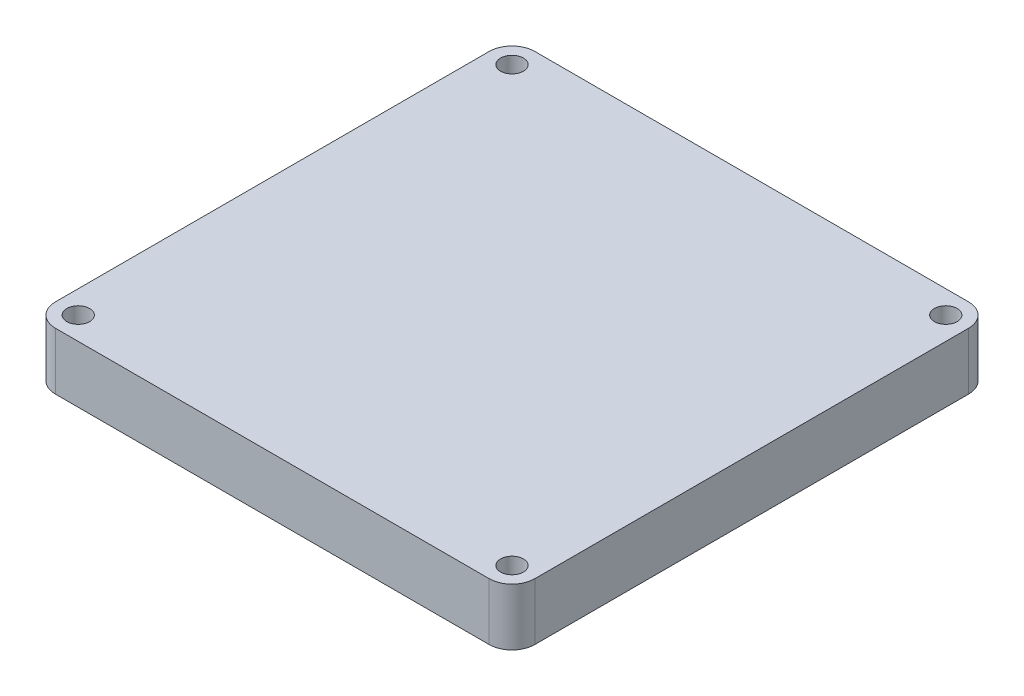
ISO-10303-21;
HEADER;
FILE_DESCRIPTION(('STEP AP214'),'2;1');
FILE_NAME('part.step','',(''),(''),'','','');
FILE_SCHEMA(('AUTOMOTIVE_DESIGN { 1 0 10303 214 1 1 1 1 }'));
ENDSEC;
DATA;
#1=APPLICATION_CONTEXT('core data for automotive mechanical design processes');
#2=APPLICATION_PROTOCOL_DEFINITION('international standard','automotive_design',2000,#1);
#3=PRODUCT_CONTEXT('',#1,'mechanical');
#4=PRODUCT('Part','Part','',(#3));
#5=PRODUCT_RELATED_PRODUCT_CATEGORY('part','',(#4));
#6=PRODUCT_DEFINITION_FORMATION('','',#4);
#7=PRODUCT_DEFINITION_CONTEXT('part definition',#1,'design');
#8=PRODUCT_DEFINITION('design','',#6,#7);
#9=PRODUCT_DEFINITION_SHAPE('','',#8);
#10=(LENGTH_UNIT() NAMED_UNIT(*) SI_UNIT(.MILLI.,.METRE.));
#11=(NAMED_UNIT(*) PLANE_ANGLE_UNIT() SI_UNIT($,.RADIAN.));
#12=(NAMED_UNIT(*) SI_UNIT($,.STERADIAN.) SOLID_ANGLE_UNIT());
#13=UNCERTAINTY_MEASURE_WITH_UNIT(LENGTH_MEASURE(1.E-05),#10,'distance_accuracy_value','');
#14=(GEOMETRIC_REPRESENTATION_CONTEXT(3) GLOBAL_UNCERTAINTY_ASSIGNED_CONTEXT((#13)) GLOBAL_UNIT_ASSIGNED_CONTEXT((#10,
#11,#12)) REPRESENTATION_CONTEXT('',''));
#15=CARTESIAN_POINT('',(0.,0.,0.));
#16=DIRECTION('',(0.,0.,1.));
#17=DIRECTION('',(1.,0.,0.));
#18=AXIS2_PLACEMENT_3D('',#15,#16,#17);
#19=CARTESIAN_POINT('',(19.,5.,-19.));
#20=DIRECTION('',(0.,-1.,0.));
#21=DIRECTION('',(0.,0.,-1.));
#22=AXIS2_PLACEMENT_3D('',#19,#20,#21);
#23=CYLINDRICAL_SURFACE('',#22,2.);
#24=CARTESIAN_POINT('',(19.,0.,-19.));
#25=DIRECTION('',(0.,1.,0.));
#26=DIRECTION('',(0.,0.,-1.));
#27=AXIS2_PLACEMENT_3D('',#24,#25,#26);
#28=CIRCLE('',#27,2.);
#29=CARTESIAN_POINT('',(21.,0.,-19.));
#30=VERTEX_POINT('',#29);
#31=CARTESIAN_POINT('',(19.,0.,-21.));
#32=VERTEX_POINT('',#31);
#33=EDGE_CURVE('E129',#30,#32,#28,.T.);
#34=ORIENTED_EDGE('',*,*,#33,.T.);
#35=DIRECTION('',(0.,-1.,0.));
#36=VECTOR('',#35,1.);
#37=CARTESIAN_POINT('',(19.,5.,-21.));
#38=LINE('',#37,#36);
#39=CARTESIAN_POINT('',(19.,5.,-21.));
#40=VERTEX_POINT('',#39);
#41=EDGE_CURVE('E11',#40,#32,#38,.T.);
#42=ORIENTED_EDGE('',*,*,#41,.F.);
#43=CARTESIAN_POINT('',(19.,5.,-19.));
#44=DIRECTION('',(0.,1.,0.));
#45=DIRECTION('',(0.,0.,-1.));
#46=AXIS2_PLACEMENT_3D('',#43,#44,#45);
#47=CIRCLE('',#46,2.);
#48=CARTESIAN_POINT('',(21.,5.,-19.));
#49=VERTEX_POINT('',#48);
#50=EDGE_CURVE('E144',#49,#40,#47,.T.);
#51=ORIENTED_EDGE('',*,*,#50,.F.);
#52=DIRECTION('',(0.,-1.,0.));
#53=VECTOR('',#52,1.);
#54=CARTESIAN_POINT('',(21.,5.,-19.));
#55=LINE('',#54,#53);
#56=EDGE_CURVE('E125',#49,#30,#55,.T.);
#57=ORIENTED_EDGE('',*,*,#56,.T.);
#58=EDGE_LOOP('',(#34,#42,#51,#57));
#59=FACE_BOUND('',#58,.T.);
#60=ADVANCED_FACE('F33',(#59),#23,.T.);
#61=CARTESIAN_POINT('',(-19.,5.,-21.));
#62=DIRECTION('',(0.,0.,1.));
#63=DIRECTION('',(1.,0.,0.));
#64=AXIS2_PLACEMENT_3D('',#61,#62,#63);
#65=PLANE('',#64);
#66=DIRECTION('',(-1.,0.,0.));
#67=VECTOR('',#66,1.);
#68=CARTESIAN_POINT('',(-19.,0.,-21.));
#69=LINE('',#68,#67);
#70=CARTESIAN_POINT('',(-19.,0.,-21.));
#71=VERTEX_POINT('',#70);
#72=EDGE_CURVE('E132',#32,#71,#69,.T.);
#73=ORIENTED_EDGE('',*,*,#72,.T.);
#74=DIRECTION('',(0.,-1.,0.));
#75=VECTOR('',#74,1.);
#76=CARTESIAN_POINT('',(-19.,5.,-21.));
#77=LINE('',#76,#75);
#78=CARTESIAN_POINT('',(-19.,5.,-21.));
#79=VERTEX_POINT('',#78);
#80=EDGE_CURVE('E41',#79,#71,#77,.T.);
#81=ORIENTED_EDGE('',*,*,#80,.F.);
#82=DIRECTION('',(-1.,0.,0.));
#83=VECTOR('',#82,1.);
#84=CARTESIAN_POINT('',(-19.,5.,-21.));
#85=LINE('',#84,#83);
#86=EDGE_CURVE('E92',#40,#79,#85,.T.);
#87=ORIENTED_EDGE('',*,*,#86,.F.);
#88=ORIENTED_EDGE('',*,*,#41,.T.);
#89=EDGE_LOOP('',(#73,#81,#87,#88));
#90=FACE_BOUND('',#89,.T.);
#91=ADVANCED_FACE('F229',(#90),#65,.F.);
#92=CARTESIAN_POINT('',(-19.,5.,-19.));
#93=DIRECTION('',(0.,-1.,0.));
#94=DIRECTION('',(0.,0.,-1.));
#95=AXIS2_PLACEMENT_3D('',#92,#93,#94);
#96=CYLINDRICAL_SURFACE('',#95,2.);
#97=CARTESIAN_POINT('',(-19.,0.,-19.));
#98=DIRECTION('',(0.,1.,0.));
#99=DIRECTION('',(0.,0.,-1.));
#100=AXIS2_PLACEMENT_3D('',#97,#98,#99);
#101=CIRCLE('',#100,2.);
#102=CARTESIAN_POINT('',(-21.,0.,-19.));
#103=VERTEX_POINT('',#102);
#104=EDGE_CURVE('E135',#71,#103,#101,.T.);
#105=ORIENTED_EDGE('',*,*,#104,.T.);
#106=DIRECTION('',(0.,-1.,0.));
#107=VECTOR('',#106,1.);
#108=CARTESIAN_POINT('',(-21.,5.,-19.));
#109=LINE('',#108,#107);
#110=CARTESIAN_POINT('',(-21.,5.,-19.));
#111=VERTEX_POINT('',#110);
#112=EDGE_CURVE('E151',#111,#103,#109,.T.);
#113=ORIENTED_EDGE('',*,*,#112,.F.);
#114=CARTESIAN_POINT('',(-19.,5.,-19.));
#115=DIRECTION('',(0.,1.,0.));
#116=DIRECTION('',(0.,0.,-1.));
#117=AXIS2_PLACEMENT_3D('',#114,#115,#116);
#118=CIRCLE('',#117,2.);
#119=EDGE_CURVE('E159',#79,#111,#118,.T.);
#120=ORIENTED_EDGE('',*,*,#119,.F.);
#121=ORIENTED_EDGE('',*,*,#80,.T.);
#122=EDGE_LOOP('',(#105,#113,#120,#121));
#123=FACE_BOUND('',#122,.T.);
#124=ADVANCED_FACE('F157',(#123),#96,.T.);
#125=CARTESIAN_POINT('',(-21.,5.,19.));
#126=DIRECTION('',(1.,0.,0.));
#127=DIRECTION('',(0.,0.,-1.));
#128=AXIS2_PLACEMENT_3D('',#125,#126,#127);
#129=PLANE('',#128);
#130=DIRECTION('',(0.,0.,1.));
#131=VECTOR('',#130,1.);
#132=CARTESIAN_POINT('',(-21.,0.,19.));
#133=LINE('',#132,#131);
#134=CARTESIAN_POINT('',(-21.,0.,19.));
#135=VERTEX_POINT('',#134);
#136=EDGE_CURVE('E137',#103,#135,#133,.T.);
#137=ORIENTED_EDGE('',*,*,#136,.T.);
#138=DIRECTION('',(0.,-1.,0.));
#139=VECTOR('',#138,1.);
#140=CARTESIAN_POINT('',(-21.,5.,19.));
#141=LINE('',#140,#139);
#142=CARTESIAN_POINT('',(-21.,5.,19.));
#143=VERTEX_POINT('',#142);
#144=EDGE_CURVE('E148',#143,#135,#141,.T.);
#145=ORIENTED_EDGE('',*,*,#144,.F.);
#146=DIRECTION('',(0.,0.,1.));
#147=VECTOR('',#146,1.);
#148=CARTESIAN_POINT('',(-21.,5.,19.));
#149=LINE('',#148,#147);
#150=EDGE_CURVE('E171',#111,#143,#149,.T.);
#151=ORIENTED_EDGE('',*,*,#150,.F.);
#152=ORIENTED_EDGE('',*,*,#112,.T.);
#153=EDGE_LOOP('',(#137,#145,#151,#152));
#154=FACE_BOUND('',#153,.T.);
#155=ADVANCED_FACE('F167',(#154),#129,.F.);
#156=CARTESIAN_POINT('',(-19.,5.,19.));
#157=DIRECTION('',(0.,-1.,0.));
#158=DIRECTION('',(0.,0.,-1.));
#159=AXIS2_PLACEMENT_3D('',#156,#157,#158);
#160=CYLINDRICAL_SURFACE('',#159,2.);
#161=CARTESIAN_POINT('',(-19.,0.,19.));
#162=DIRECTION('',(0.,1.,0.));
#163=DIRECTION('',(0.,0.,-1.));
#164=AXIS2_PLACEMENT_3D('',#161,#162,#163);
#165=CIRCLE('',#164,2.);
#166=CARTESIAN_POINT('',(-19.,0.,21.));
#167=VERTEX_POINT('',#166);
#168=EDGE_CURVE('E139',#135,#167,#165,.T.);
#169=ORIENTED_EDGE('',*,*,#168,.T.);
#170=DIRECTION('',(0.,-1.,0.));
#171=VECTOR('',#170,1.);
#172=CARTESIAN_POINT('',(-19.,5.,21.));
#173=LINE('',#172,#171);
#174=CARTESIAN_POINT('',(-19.,5.,21.));
#175=VERTEX_POINT('',#174);
#176=EDGE_CURVE('E120',#175,#167,#173,.T.);
#177=ORIENTED_EDGE('',*,*,#176,.F.);
#178=CARTESIAN_POINT('',(-19.,5.,19.));
#179=DIRECTION('',(0.,1.,0.));
#180=DIRECTION('',(0.,0.,-1.));
#181=AXIS2_PLACEMENT_3D('',#178,#179,#180);
#182=CIRCLE('',#181,2.);
#183=EDGE_CURVE('E111',#143,#175,#182,.T.);
#184=ORIENTED_EDGE('',*,*,#183,.F.);
#185=ORIENTED_EDGE('',*,*,#144,.T.);
#186=EDGE_LOOP('',(#169,#177,#184,#185));
#187=FACE_BOUND('',#186,.T.);
#188=ADVANCED_FACE('F170',(#187),#160,.T.);
#189=CARTESIAN_POINT('',(-19.,5.,21.));
#190=DIRECTION('',(0.,0.,-1.));
#191=DIRECTION('',(-1.,0.,0.));
#192=AXIS2_PLACEMENT_3D('',#189,#190,#191);
#193=PLANE('',#192);
#194=DIRECTION('',(1.,0.,0.));
#195=VECTOR('',#194,1.);
#196=CARTESIAN_POINT('',(-19.,0.,21.));
#197=LINE('',#196,#195);
#198=CARTESIAN_POINT('',(19.,0.,21.));
#199=VERTEX_POINT('',#198);
#200=EDGE_CURVE('E119',#167,#199,#197,.T.);
#201=ORIENTED_EDGE('',*,*,#200,.T.);
#202=DIRECTION('',(0.,-1.,0.));
#203=VECTOR('',#202,1.);
#204=CARTESIAN_POINT('',(19.,5.,21.));
#205=LINE('',#204,#203);
#206=CARTESIAN_POINT('',(19.,5.,21.));
#207=VERTEX_POINT('',#206);
#208=EDGE_CURVE('E116',#207,#199,#205,.T.);
#209=ORIENTED_EDGE('',*,*,#208,.F.);
#210=DIRECTION('',(1.,0.,0.));
#211=VECTOR('',#210,1.);
#212=CARTESIAN_POINT('',(-19.,5.,21.));
#213=LINE('',#212,#211);
#214=EDGE_CURVE('E105',#175,#207,#213,.T.);
#215=ORIENTED_EDGE('',*,*,#214,.F.);
#216=ORIENTED_EDGE('',*,*,#176,.T.);
#217=EDGE_LOOP('',(#201,#209,#215,#216));
#218=FACE_BOUND('',#217,.T.);
#219=ADVANCED_FACE('F117',(#218),#193,.F.);
#220=CARTESIAN_POINT('',(19.,5.,19.));
#221=DIRECTION('',(0.,-1.,0.));
#222=DIRECTION('',(0.,0.,-1.));
#223=AXIS2_PLACEMENT_3D('',#220,#221,#222);
#224=CYLINDRICAL_SURFACE('',#223,2.);
#225=CARTESIAN_POINT('',(19.,0.,19.));
#226=DIRECTION('',(0.,1.,0.));
#227=DIRECTION('',(0.,0.,1.));
#228=AXIS2_PLACEMENT_3D('',#225,#226,#227);
#229=CIRCLE('',#228,2.);
#230=CARTESIAN_POINT('',(21.,0.,19.));
#231=VERTEX_POINT('',#230);
#232=EDGE_CURVE('E78',#199,#231,#229,.T.);
#233=ORIENTED_EDGE('',*,*,#232,.T.);
#234=DIRECTION('',(0.,-1.,0.));
#235=VECTOR('',#234,1.);
#236=CARTESIAN_POINT('',(21.,5.,19.));
#237=LINE('',#236,#235);
#238=CARTESIAN_POINT('',(21.,5.,19.));
#239=VERTEX_POINT('',#238);
#240=EDGE_CURVE('E121',#239,#231,#237,.T.);
#241=ORIENTED_EDGE('',*,*,#240,.F.);
#242=CARTESIAN_POINT('',(19.,5.,19.));
#243=DIRECTION('',(0.,1.,0.));
#244=DIRECTION('',(0.,0.,1.));
#245=AXIS2_PLACEMENT_3D('',#242,#243,#244);
#246=CIRCLE('',#245,2.);
#247=EDGE_CURVE('E109',#207,#239,#246,.T.);
#248=ORIENTED_EDGE('',*,*,#247,.F.);
#249=ORIENTED_EDGE('',*,*,#208,.T.);
#250=EDGE_LOOP('',(#233,#241,#248,#249));
#251=FACE_BOUND('',#250,.T.);
#252=ADVANCED_FACE('F123',(#251),#224,.T.);
#253=CARTESIAN_POINT('',(21.,5.,19.));
#254=DIRECTION('',(-1.,0.,0.));
#255=DIRECTION('',(0.,0.,1.));
#256=AXIS2_PLACEMENT_3D('',#253,#254,#255);
#257=PLANE('',#256);
#258=DIRECTION('',(0.,0.,-1.));
#259=VECTOR('',#258,1.);
#260=CARTESIAN_POINT('',(21.,0.,19.));
#261=LINE('',#260,#259);
#262=EDGE_CURVE('E84',#231,#30,#261,.T.);
#263=ORIENTED_EDGE('',*,*,#262,.T.);
#264=ORIENTED_EDGE('',*,*,#56,.F.);
#265=DIRECTION('',(0.,0.,-1.));
#266=VECTOR('',#265,1.);
#267=CARTESIAN_POINT('',(21.,5.,19.));
#268=LINE('',#267,#266);
#269=EDGE_CURVE('E49',#239,#49,#268,.T.);
#270=ORIENTED_EDGE('',*,*,#269,.F.);
#271=ORIENTED_EDGE('',*,*,#240,.T.);
#272=EDGE_LOOP('',(#263,#264,#270,#271));
#273=FACE_BOUND('',#272,.T.);
#274=ADVANCED_FACE('F205',(#273),#257,.F.);
#275=CARTESIAN_POINT('',(19.,5.,-19.));
#276=DIRECTION('',(0.,-1.,0.));
#277=DIRECTION('',(0.,0.,-1.));
#278=AXIS2_PLACEMENT_3D('',#275,#276,#277);
#279=PLANE('',#278);
#280=CARTESIAN_POINT('',(-19.,5.,19.));
#281=DIRECTION('',(0.,1.,0.));
#282=DIRECTION('',(0.,0.,1.));
#283=AXIS2_PLACEMENT_3D('',#280,#281,#282);
#284=CIRCLE('',#283,0.999999999999987);
#285=CARTESIAN_POINT('',(-19.,5.,20.));
#286=VERTEX_POINT('',#285);
#287=EDGE_CURVE('E197',#286,#286,#284,.T.);
#288=ORIENTED_EDGE('',*,*,#287,.F.);
#289=EDGE_LOOP('',(#288));
#290=FACE_BOUND('',#289,.T.);
#291=CARTESIAN_POINT('',(19.,5.,19.));
#292=DIRECTION('',(0.,1.,0.));
#293=DIRECTION('',(0.,0.,1.));
#294=AXIS2_PLACEMENT_3D('',#291,#292,#293);
#295=CIRCLE('',#294,0.999999999999987);
#296=CARTESIAN_POINT('',(19.,5.,20.));
#297=VERTEX_POINT('',#296);
#298=EDGE_CURVE('E191',#297,#297,#295,.T.);
#299=ORIENTED_EDGE('',*,*,#298,.F.);
#300=EDGE_LOOP('',(#299));
#301=FACE_BOUND('',#300,.T.);
#302=CARTESIAN_POINT('',(19.,5.,-19.));
#303=DIRECTION('',(0.,1.,0.));
#304=DIRECTION('',(0.,0.,1.));
#305=AXIS2_PLACEMENT_3D('',#302,#303,#304);
#306=CIRCLE('',#305,0.999999999999987);
#307=CARTESIAN_POINT('',(19.,5.,-18.));
#308=VERTEX_POINT('',#307);
#309=EDGE_CURVE('E185',#308,#308,#306,.T.);
#310=ORIENTED_EDGE('',*,*,#309,.F.);
#311=EDGE_LOOP('',(#310));
#312=FACE_BOUND('',#311,.T.);
#313=CARTESIAN_POINT('',(-19.,5.,-19.));
#314=DIRECTION('',(0.,1.,0.));
#315=DIRECTION('',(0.,0.,1.));
#316=AXIS2_PLACEMENT_3D('',#313,#314,#315);
#317=CIRCLE('',#316,0.999999999999987);
#318=CARTESIAN_POINT('',(-19.,5.,-18.));
#319=VERTEX_POINT('',#318);
#320=EDGE_CURVE('E179',#319,#319,#317,.T.);
#321=ORIENTED_EDGE('',*,*,#320,.F.);
#322=EDGE_LOOP('',(#321));
#323=FACE_BOUND('',#322,.T.);
#324=ORIENTED_EDGE('',*,*,#50,.T.);
#325=ORIENTED_EDGE('',*,*,#86,.T.);
#326=ORIENTED_EDGE('',*,*,#119,.T.);
#327=ORIENTED_EDGE('',*,*,#150,.T.);
#328=ORIENTED_EDGE('',*,*,#183,.T.);
#329=ORIENTED_EDGE('',*,*,#214,.T.);
#330=ORIENTED_EDGE('',*,*,#247,.T.);
#331=ORIENTED_EDGE('',*,*,#269,.T.);
#332=EDGE_LOOP('',(#324,#325,#326,#327,#328,#329,#330,#331));
#333=FACE_BOUND('',#332,.T.);
#334=ADVANCED_FACE('F107',(#290,#301,#312,#323,#333),#279,.F.);
#335=CARTESIAN_POINT('',(19.,0.,-19.));
#336=DIRECTION('',(0.,-1.,0.));
#337=DIRECTION('',(0.,0.,-1.));
#338=AXIS2_PLACEMENT_3D('',#335,#336,#337);
#339=PLANE('',#338);
#340=CARTESIAN_POINT('',(-19.,0.,19.));
#341=DIRECTION('',(0.,1.,0.));
#342=DIRECTION('',(0.,0.,1.));
#343=AXIS2_PLACEMENT_3D('',#340,#341,#342);
#344=CIRCLE('',#343,0.999999999999997);
#345=CARTESIAN_POINT('',(-19.,0.,20.));
#346=VERTEX_POINT('',#345);
#347=EDGE_CURVE('E194',#346,#346,#344,.T.);
#348=ORIENTED_EDGE('',*,*,#347,.T.);
#349=EDGE_LOOP('',(#348));
#350=FACE_BOUND('',#349,.T.);
#351=CARTESIAN_POINT('',(19.,0.,19.));
#352=DIRECTION('',(0.,1.,0.));
#353=DIRECTION('',(0.,0.,1.));
#354=AXIS2_PLACEMENT_3D('',#351,#352,#353);
#355=CIRCLE('',#354,0.999999999999997);
#356=CARTESIAN_POINT('',(19.,0.,20.));
#357=VERTEX_POINT('',#356);
#358=EDGE_CURVE('E188',#357,#357,#355,.T.);
#359=ORIENTED_EDGE('',*,*,#358,.T.);
#360=EDGE_LOOP('',(#359));
#361=FACE_BOUND('',#360,.T.);
#362=CARTESIAN_POINT('',(19.,0.,-19.));
#363=DIRECTION('',(0.,1.,0.));
#364=DIRECTION('',(0.,0.,1.));
#365=AXIS2_PLACEMENT_3D('',#362,#363,#364);
#366=CIRCLE('',#365,0.999999999999997);
#367=CARTESIAN_POINT('',(19.,0.,-18.));
#368=VERTEX_POINT('',#367);
#369=EDGE_CURVE('E182',#368,#368,#366,.T.);
#370=ORIENTED_EDGE('',*,*,#369,.T.);
#371=EDGE_LOOP('',(#370));
#372=FACE_BOUND('',#371,.T.);
#373=CARTESIAN_POINT('',(-19.,0.,-19.));
#374=DIRECTION('',(0.,1.,0.));
#375=DIRECTION('',(0.,0.,1.));
#376=AXIS2_PLACEMENT_3D('',#373,#374,#375);
#377=CIRCLE('',#376,0.999999999999997);
#378=CARTESIAN_POINT('',(-19.,0.,-18.));
#379=VERTEX_POINT('',#378);
#380=EDGE_CURVE('E133',#379,#379,#377,.T.);
#381=ORIENTED_EDGE('',*,*,#380,.T.);
#382=EDGE_LOOP('',(#381));
#383=FACE_BOUND('',#382,.T.);
#384=ORIENTED_EDGE('',*,*,#33,.F.);
#385=ORIENTED_EDGE('',*,*,#262,.F.);
#386=ORIENTED_EDGE('',*,*,#232,.F.);
#387=ORIENTED_EDGE('',*,*,#200,.F.);
#388=ORIENTED_EDGE('',*,*,#168,.F.);
#389=ORIENTED_EDGE('',*,*,#136,.F.);
#390=ORIENTED_EDGE('',*,*,#104,.F.);
#391=ORIENTED_EDGE('',*,*,#72,.F.);
#392=EDGE_LOOP('',(#384,#385,#386,#387,#388,#389,#390,#391));
#393=FACE_BOUND('',#392,.T.);
#394=ADVANCED_FACE('F163',(#350,#361,#372,#383,#393),#339,.T.);
#395=CARTESIAN_POINT('',(-19.,5.,-19.));
#396=DIRECTION('',(0.,1.,0.));
#397=DIRECTION('',(0.,0.,1.));
#398=AXIS2_PLACEMENT_3D('',#395,#396,#397);
#399=CYLINDRICAL_SURFACE('',#398,0.999999999999992);
#400=ORIENTED_EDGE('',*,*,#380,.F.);
#401=EDGE_LOOP('',(#400));
#402=FACE_BOUND('',#401,.T.);
#403=ORIENTED_EDGE('',*,*,#320,.T.);
#404=EDGE_LOOP('',(#403));
#405=FACE_BOUND('',#404,.T.);
#406=ADVANCED_FACE('F213',(#402,#405),#399,.F.);
#407=CARTESIAN_POINT('',(19.,5.,-19.));
#408=DIRECTION('',(0.,1.,0.));
#409=DIRECTION('',(0.,0.,1.));
#410=AXIS2_PLACEMENT_3D('',#407,#408,#409);
#411=CYLINDRICAL_SURFACE('',#410,0.999999999999992);
#412=ORIENTED_EDGE('',*,*,#369,.F.);
#413=EDGE_LOOP('',(#412));
#414=FACE_BOUND('',#413,.T.);
#415=ORIENTED_EDGE('',*,*,#309,.T.);
#416=EDGE_LOOP('',(#415));
#417=FACE_BOUND('',#416,.T.);
#418=ADVANCED_FACE('F215',(#414,#417),#411,.F.);
#419=CARTESIAN_POINT('',(19.,5.,19.));
#420=DIRECTION('',(0.,1.,0.));
#421=DIRECTION('',(0.,0.,1.));
#422=AXIS2_PLACEMENT_3D('',#419,#420,#421);
#423=CYLINDRICAL_SURFACE('',#422,0.999999999999992);
#424=ORIENTED_EDGE('',*,*,#358,.F.);
#425=EDGE_LOOP('',(#424));
#426=FACE_BOUND('',#425,.T.);
#427=ORIENTED_EDGE('',*,*,#298,.T.);
#428=EDGE_LOOP('',(#427));
#429=FACE_BOUND('',#428,.T.);
#430=ADVANCED_FACE('F222',(#426,#429),#423,.F.);
#431=CARTESIAN_POINT('',(-19.,5.,19.));
#432=DIRECTION('',(0.,1.,0.));
#433=DIRECTION('',(0.,0.,1.));
#434=AXIS2_PLACEMENT_3D('',#431,#432,#433);
#435=CYLINDRICAL_SURFACE('',#434,0.999999999999992);
#436=ORIENTED_EDGE('',*,*,#347,.F.);
#437=EDGE_LOOP('',(#436));
#438=FACE_BOUND('',#437,.T.);
#439=ORIENTED_EDGE('',*,*,#287,.T.);
#440=EDGE_LOOP('',(#439));
#441=FACE_BOUND('',#440,.T.);
#442=ADVANCED_FACE('F201',(#438,#441),#435,.F.);
#443=CLOSED_SHELL('',(#60,#91,#124,#155,#188,#219,#252,#274,#334,#394,#406,#418,#430,#442));
#444=MANIFOLD_SOLID_BREP('B2',#443);
#445=ADVANCED_BREP_SHAPE_REPRESENTATION('',(#18,#444),#14);
#446=SHAPE_DEFINITION_REPRESENTATION(#9,#445);
ENDSEC;
END-ISO-10303-21;
